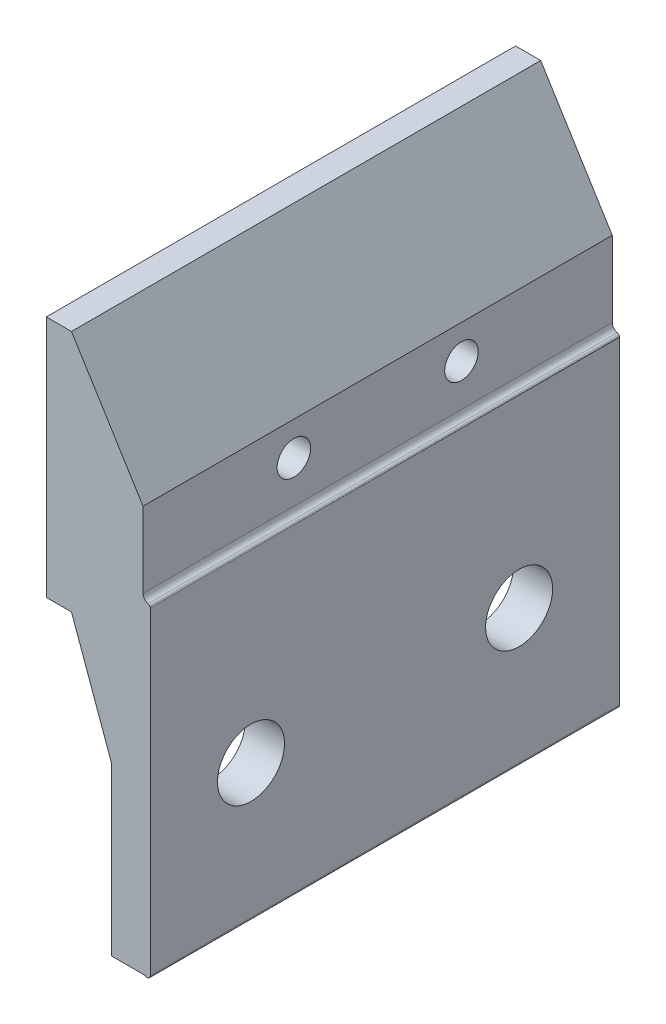
ISO-10303-21;
HEADER;
FILE_DESCRIPTION(('STEP AP214'),'2;1');
FILE_NAME('part.step','',(''),(''),'','','');
FILE_SCHEMA(('AUTOMOTIVE_DESIGN { 1 0 10303 214 1 1 1 1 }'));
ENDSEC;
DATA;
#1=APPLICATION_CONTEXT('core data for automotive mechanical design processes');
#2=APPLICATION_PROTOCOL_DEFINITION('international standard','automotive_design',2000,#1);
#3=PRODUCT_CONTEXT('',#1,'mechanical');
#4=PRODUCT('Part','Part','',(#3));
#5=PRODUCT_RELATED_PRODUCT_CATEGORY('part','',(#4));
#6=PRODUCT_DEFINITION_FORMATION('','',#4);
#7=PRODUCT_DEFINITION_CONTEXT('part definition',#1,'design');
#8=PRODUCT_DEFINITION('design','',#6,#7);
#9=PRODUCT_DEFINITION_SHAPE('','',#8);
#10=(LENGTH_UNIT() NAMED_UNIT(*) SI_UNIT(.MILLI.,.METRE.));
#11=(NAMED_UNIT(*) PLANE_ANGLE_UNIT() SI_UNIT($,.RADIAN.));
#12=(NAMED_UNIT(*) SI_UNIT($,.STERADIAN.) SOLID_ANGLE_UNIT());
#13=UNCERTAINTY_MEASURE_WITH_UNIT(LENGTH_MEASURE(1.E-05),#10,'distance_accuracy_value','');
#14=(GEOMETRIC_REPRESENTATION_CONTEXT(3) GLOBAL_UNCERTAINTY_ASSIGNED_CONTEXT((#13)) GLOBAL_UNIT_ASSIGNED_CONTEXT((#10,
#11,#12)) REPRESENTATION_CONTEXT('',''));
#15=CARTESIAN_POINT('',(0.,0.,0.));
#16=DIRECTION('',(0.,0.,1.));
#17=DIRECTION('',(1.,0.,0.));
#18=AXIS2_PLACEMENT_3D('',#15,#16,#17);
#19=CARTESIAN_POINT('',(-15.8526395142513,-15.4933634784557,28.));
#20=DIRECTION('',(1.,0.,0.));
#21=DIRECTION('',(0.,1.,0.));
#22=AXIS2_PLACEMENT_3D('',#19,#20,#21);
#23=PLANE('',#22);
#24=CARTESIAN_POINT('',(-15.8526395142514,-24.3915109359898,19.));
#25=DIRECTION('',(1.,0.,0.));
#26=DIRECTION('',(0.,1.,0.));
#27=AXIS2_PLACEMENT_3D('',#24,#25,#26);
#28=CIRCLE('',#27,1.);
#29=CARTESIAN_POINT('',(-15.8526395142514,-23.3915109359898,19.));
#30=VERTEX_POINT('',#29);
#31=EDGE_CURVE('E177',#30,#30,#28,.T.);
#32=ORIENTED_EDGE('',*,*,#31,.T.);
#33=EDGE_LOOP('',(#32));
#34=FACE_BOUND('',#33,.T.);
#35=DIRECTION('',(0.,-1.,0.));
#36=VECTOR('',#35,1.);
#37=CARTESIAN_POINT('',(-15.8526395142513,-15.4933634784557,0.));
#38=LINE('',#37,#36);
#39=CARTESIAN_POINT('',(-15.8526395142513,-15.4933634784557,0.));
#40=VERTEX_POINT('',#39);
#41=CARTESIAN_POINT('',(-15.8526395142514,-29.9933634784557,0.));
#42=VERTEX_POINT('',#41);
#43=EDGE_CURVE('E198',#40,#42,#38,.T.);
#44=ORIENTED_EDGE('',*,*,#43,.T.);
#45=DIRECTION('',(0.,0.,-1.));
#46=VECTOR('',#45,1.);
#47=CARTESIAN_POINT('',(-15.8526395142514,-29.9933634784557,28.));
#48=LINE('',#47,#46);
#49=CARTESIAN_POINT('',(-15.8526395142514,-29.9933634784557,28.));
#50=VERTEX_POINT('',#49);
#51=EDGE_CURVE('E11',#50,#42,#48,.T.);
#52=ORIENTED_EDGE('',*,*,#51,.F.);
#53=DIRECTION('',(0.,-1.,0.));
#54=VECTOR('',#53,1.);
#55=CARTESIAN_POINT('',(-15.8526395142513,-15.4933634784557,28.));
#56=LINE('',#55,#54);
#57=CARTESIAN_POINT('',(-15.8526395142513,-15.4933634784557,28.));
#58=VERTEX_POINT('',#57);
#59=EDGE_CURVE('E199',#58,#50,#56,.T.);
#60=ORIENTED_EDGE('',*,*,#59,.F.);
#61=DIRECTION('',(0.,0.,-1.));
#62=VECTOR('',#61,1.);
#63=CARTESIAN_POINT('',(-15.8526395142513,-15.4933634784557,28.));
#64=LINE('',#63,#62);
#65=EDGE_CURVE('E237',#58,#40,#64,.T.);
#66=ORIENTED_EDGE('',*,*,#65,.T.);
#67=EDGE_LOOP('',(#44,#52,#60,#66));
#68=FACE_BOUND('',#67,.T.);
#69=CARTESIAN_POINT('',(-15.8526395142514,-24.3915109359898,8.99999999999999));
#70=DIRECTION('',(1.,0.,0.));
#71=DIRECTION('',(0.,1.,0.));
#72=AXIS2_PLACEMENT_3D('',#69,#70,#71);
#73=CIRCLE('',#72,1.);
#74=CARTESIAN_POINT('',(-15.8526395142514,-23.3915109359898,8.99999999999999));
#75=VERTEX_POINT('',#74);
#76=EDGE_CURVE('E184',#75,#75,#73,.F.);
#77=ORIENTED_EDGE('',*,*,#76,.F.);
#78=EDGE_LOOP('',(#77));
#79=FACE_BOUND('',#78,.T.);
#80=ADVANCED_FACE('F45',(#34,#68,#79),#23,.F.);
#81=CARTESIAN_POINT('',(-14.3526395142514,-29.9933634784557,28.));
#82=DIRECTION('',(0.940596179684519,0.339527357900491,0.));
#83=DIRECTION('',(-0.339527357900491,0.940596179684519,0.));
#84=AXIS2_PLACEMENT_3D('',#81,#82,#83);
#85=PLANE('',#84);
#86=DIRECTION('',(0.,0.,-1.));
#87=VECTOR('',#86,1.);
#88=CARTESIAN_POINT('',(-11.9759480089479,-36.5775367362473,28.));
#89=LINE('',#88,#87);
#90=CARTESIAN_POINT('',(-11.9759480089479,-36.5775367362473,21.2445979279549));
#91=VERTEX_POINT('',#90);
#92=CARTESIAN_POINT('',(-11.9759480089479,-36.5775367362473,6.75540207204496));
#93=VERTEX_POINT('',#92);
#94=EDGE_CURVE('E155',#91,#93,#89,.T.);
#95=ORIENTED_EDGE('',*,*,#94,.F.);
#96=CARTESIAN_POINT('',(-11.3074831359265,-38.4293919437487,22.));
#97=DIRECTION('',(0.940596179684519,0.339527357900491,0.));
#98=DIRECTION('',(0.339527357900491,-0.940596179684519,0.));
#99=AXIS2_PLACEMENT_3D('',#96,#97,#98);
#100=ELLIPSE('',#99,2.12631099636277,2.);
#101=CARTESIAN_POINT('',(-11.9759480089479,-36.5775367362473,22.7554020720451));
#102=VERTEX_POINT('',#101);
#103=EDGE_CURVE('E68',#91,#102,#100,.T.);
#104=ORIENTED_EDGE('',*,*,#103,.T.);
#105=CARTESIAN_POINT('',(-11.9759480089479,-36.5775367362473,28.));
#106=VERTEX_POINT('',#105);
#107=EDGE_CURVE('E164',#106,#102,#89,.T.);
#108=ORIENTED_EDGE('',*,*,#107,.F.);
#109=DIRECTION('',(0.339527357900491,-0.940596179684519,0.));
#110=VECTOR('',#109,1.);
#111=CARTESIAN_POINT('',(-14.3526395142514,-29.9933634784557,28.));
#112=LINE('',#111,#110);
#113=CARTESIAN_POINT('',(-14.3526395142514,-29.9933634784557,28.));
#114=VERTEX_POINT('',#113);
#115=EDGE_CURVE('E207',#114,#106,#112,.T.);
#116=ORIENTED_EDGE('',*,*,#115,.F.);
#117=DIRECTION('',(0.,0.,-1.));
#118=VECTOR('',#117,1.);
#119=CARTESIAN_POINT('',(-14.3526395142514,-29.9933634784557,28.));
#120=LINE('',#119,#118);
#121=CARTESIAN_POINT('',(-14.3526395142514,-29.9933634784557,0.));
#122=VERTEX_POINT('',#121);
#123=EDGE_CURVE('E54',#114,#122,#120,.T.);
#124=ORIENTED_EDGE('',*,*,#123,.T.);
#125=DIRECTION('',(0.339527357900491,-0.940596179684519,0.));
#126=VECTOR('',#125,1.);
#127=CARTESIAN_POINT('',(-14.3526395142514,-29.9933634784557,0.));
#128=LINE('',#127,#126);
#129=CARTESIAN_POINT('',(-11.9759480089479,-36.5775367362473,0.));
#130=VERTEX_POINT('',#129);
#131=EDGE_CURVE('E244',#122,#130,#128,.T.);
#132=ORIENTED_EDGE('',*,*,#131,.T.);
#133=CARTESIAN_POINT('',(-11.9759480089479,-36.5775367362473,5.24459792795483));
#134=VERTEX_POINT('',#133);
#135=EDGE_CURVE('E157',#134,#130,#89,.T.);
#136=ORIENTED_EDGE('',*,*,#135,.F.);
#137=CARTESIAN_POINT('',(-11.3074831359265,-38.4293919437487,5.99999999999989));
#138=DIRECTION('',(0.940596179684519,0.339527357900491,0.));
#139=DIRECTION('',(0.339527357900491,-0.940596179684519,0.));
#140=AXIS2_PLACEMENT_3D('',#137,#138,#139);
#141=ELLIPSE('',#140,2.12631099636277,2.00000000000001);
#142=EDGE_CURVE('E61',#93,#134,#141,.F.);
#143=ORIENTED_EDGE('',*,*,#142,.F.);
#144=EDGE_LOOP('',(#95,#104,#108,#116,#124,#132,#136,#143));
#145=FACE_BOUND('',#144,.T.);
#146=ADVANCED_FACE('F154',(#145),#85,.F.);
#147=CARTESIAN_POINT('',(-11.9759480089479,-36.5775367362473,28.));
#148=DIRECTION('',(1.,0.,0.));
#149=DIRECTION('',(0.,1.,0.));
#150=AXIS2_PLACEMENT_3D('',#147,#148,#149);
#151=PLANE('',#150);
#152=ORIENTED_EDGE('',*,*,#107,.T.);
#153=CARTESIAN_POINT('',(-11.9759480089479,-38.4293919437487,22.));
#154=DIRECTION('',(1.,0.,0.));
#155=DIRECTION('',(0.,1.,0.));
#156=AXIS2_PLACEMENT_3D('',#153,#154,#155);
#157=CIRCLE('',#156,2.);
#158=EDGE_CURVE('E159',#102,#91,#157,.T.);
#159=ORIENTED_EDGE('',*,*,#158,.T.);
#160=ORIENTED_EDGE('',*,*,#94,.T.);
#161=CARTESIAN_POINT('',(-11.9759480089479,-38.4293919437487,5.99999999999989));
#162=DIRECTION('',(1.,0.,0.));
#163=DIRECTION('',(0.,1.,0.));
#164=AXIS2_PLACEMENT_3D('',#161,#162,#163);
#165=CIRCLE('',#164,2.00000000000001);
#166=EDGE_CURVE('E145',#134,#93,#165,.F.);
#167=ORIENTED_EDGE('',*,*,#166,.F.);
#168=ORIENTED_EDGE('',*,*,#135,.T.);
#169=DIRECTION('',(0.,-1.,0.));
#170=VECTOR('',#169,1.);
#171=CARTESIAN_POINT('',(-11.9759480089479,-36.5775367362473,0.));
#172=LINE('',#171,#170);
#173=CARTESIAN_POINT('',(-11.9759480089479,-46.5775367362473,0.));
#174=VERTEX_POINT('',#173);
#175=EDGE_CURVE('E247',#130,#174,#172,.T.);
#176=ORIENTED_EDGE('',*,*,#175,.T.);
#177=DIRECTION('',(0.,0.,-1.));
#178=VECTOR('',#177,1.);
#179=CARTESIAN_POINT('',(-11.9759480089479,-46.5775367362473,28.));
#180=LINE('',#179,#178);
#181=CARTESIAN_POINT('',(-11.9759480089479,-46.5775367362473,28.));
#182=VERTEX_POINT('',#181);
#183=EDGE_CURVE('E168',#182,#174,#180,.T.);
#184=ORIENTED_EDGE('',*,*,#183,.F.);
#185=DIRECTION('',(0.,-1.,0.));
#186=VECTOR('',#185,1.);
#187=CARTESIAN_POINT('',(-11.9759480089479,-36.5775367362473,28.));
#188=LINE('',#187,#186);
#189=EDGE_CURVE('E210',#106,#182,#188,.T.);
#190=ORIENTED_EDGE('',*,*,#189,.F.);
#191=EDGE_LOOP('',(#152,#159,#160,#167,#168,#176,#184,#190));
#192=FACE_BOUND('',#191,.T.);
#193=ADVANCED_FACE('F162',(#192),#151,.F.);
#194=CARTESIAN_POINT('',(-9.6415861078913,-27.4293919437487,28.));
#195=DIRECTION('',(-1.,0.,0.));
#196=DIRECTION('',(0.,0.,1.));
#197=AXIS2_PLACEMENT_3D('',#194,#195,#196);
#198=PLANE('',#197);
#199=DIRECTION('',(0.,1.,0.));
#200=VECTOR('',#199,1.);
#201=CARTESIAN_POINT('',(-9.6415861078913,-27.4293919437487,0.));
#202=LINE('',#201,#200);
#203=CARTESIAN_POINT('',(-9.6415861078913,-46.4293919437487,0.));
#204=VERTEX_POINT('',#203);
#205=CARTESIAN_POINT('',(-9.6415861078913,-27.4293919437487,0.));
#206=VERTEX_POINT('',#205);
#207=EDGE_CURVE('E257',#204,#206,#202,.T.);
#208=ORIENTED_EDGE('',*,*,#207,.T.);
#209=DIRECTION('',(0.,0.,-1.));
#210=VECTOR('',#209,1.);
#211=CARTESIAN_POINT('',(-9.6415861078913,-27.4293919437487,28.));
#212=LINE('',#211,#210);
#213=CARTESIAN_POINT('',(-9.6415861078913,-27.4293919437487,28.));
#214=VERTEX_POINT('',#213);
#215=EDGE_CURVE('E293',#214,#206,#212,.T.);
#216=ORIENTED_EDGE('',*,*,#215,.F.);
#217=DIRECTION('',(0.,1.,0.));
#218=VECTOR('',#217,1.);
#219=CARTESIAN_POINT('',(-9.6415861078913,-27.4293919437487,28.));
#220=LINE('',#219,#218);
#221=CARTESIAN_POINT('',(-9.6415861078913,-46.4293919437487,28.));
#222=VERTEX_POINT('',#221);
#223=EDGE_CURVE('E219',#222,#214,#220,.T.);
#224=ORIENTED_EDGE('',*,*,#223,.F.);
#225=DIRECTION('',(0.,0.,-1.));
#226=VECTOR('',#225,1.);
#227=CARTESIAN_POINT('',(-9.6415861078913,-46.4293919437487,28.));
#228=LINE('',#227,#226);
#229=EDGE_CURVE('E297',#222,#204,#228,.T.);
#230=ORIENTED_EDGE('',*,*,#229,.T.);
#231=EDGE_LOOP('',(#208,#216,#224,#230));
#232=FACE_BOUND('',#231,.T.);
#233=CARTESIAN_POINT('',(-9.64158610789127,-38.4293919437487,5.99999999999989));
#234=DIRECTION('',(1.,0.,0.));
#235=DIRECTION('',(0.,1.,0.));
#236=AXIS2_PLACEMENT_3D('',#233,#234,#235);
#237=CIRCLE('',#236,2.00000000000001);
#238=CARTESIAN_POINT('',(-9.64158610789127,-36.4293919437487,5.99999999999989));
#239=VERTEX_POINT('',#238);
#240=EDGE_CURVE('E419',#239,#239,#237,.F.);
#241=ORIENTED_EDGE('',*,*,#240,.T.);
#242=EDGE_LOOP('',(#241));
#243=FACE_BOUND('',#242,.T.);
#244=CARTESIAN_POINT('',(-9.64158610789127,-38.4293919437487,22.));
#245=DIRECTION('',(1.,0.,0.));
#246=DIRECTION('',(0.,1.,0.));
#247=AXIS2_PLACEMENT_3D('',#244,#245,#246);
#248=CIRCLE('',#247,2.);
#249=CARTESIAN_POINT('',(-9.64158610789127,-36.4293919437487,22.));
#250=VERTEX_POINT('',#249);
#251=EDGE_CURVE('E190',#250,#250,#248,.T.);
#252=ORIENTED_EDGE('',*,*,#251,.F.);
#253=EDGE_LOOP('',(#252));
#254=FACE_BOUND('',#253,.T.);
#255=ADVANCED_FACE('F325',(#232,#243,#254),#198,.F.);
#256=CARTESIAN_POINT('',(-10.0826416863058,-22.3915109359899,28.));
#257=DIRECTION('',(-1.,0.,0.));
#258=DIRECTION('',(0.,-1.,0.));
#259=AXIS2_PLACEMENT_3D('',#256,#257,#258);
#260=PLANE('',#259);
#261=CARTESIAN_POINT('',(-10.0826416863058,-24.3915109359899,19.));
#262=DIRECTION('',(-1.,0.,0.));
#263=DIRECTION('',(0.,-1.,0.));
#264=AXIS2_PLACEMENT_3D('',#261,#262,#263);
#265=CIRCLE('',#264,1.);
#266=CARTESIAN_POINT('',(-10.0826416863058,-25.3915109359899,19.));
#267=VERTEX_POINT('',#266);
#268=EDGE_CURVE('E174',#267,#267,#265,.T.);
#269=ORIENTED_EDGE('',*,*,#268,.T.);
#270=EDGE_LOOP('',(#269));
#271=FACE_BOUND('',#270,.T.);
#272=DIRECTION('',(0.,1.,0.));
#273=VECTOR('',#272,1.);
#274=CARTESIAN_POINT('',(-10.0826416863058,-22.3915109359899,0.));
#275=LINE('',#274,#273);
#276=CARTESIAN_POINT('',(-10.0826416863058,-26.8915109359899,0.));
#277=VERTEX_POINT('',#276);
#278=CARTESIAN_POINT('',(-10.0826416863058,-22.3915109359899,0.));
#279=VERTEX_POINT('',#278);
#280=EDGE_CURVE('E266',#277,#279,#275,.T.);
#281=ORIENTED_EDGE('',*,*,#280,.T.);
#282=DIRECTION('',(0.,0.,-1.));
#283=VECTOR('',#282,1.);
#284=CARTESIAN_POINT('',(-10.0826416863058,-22.3915109359899,28.));
#285=LINE('',#284,#283);
#286=CARTESIAN_POINT('',(-10.0826416863058,-22.3915109359899,28.));
#287=VERTEX_POINT('',#286);
#288=EDGE_CURVE('E281',#287,#279,#285,.T.);
#289=ORIENTED_EDGE('',*,*,#288,.F.);
#290=DIRECTION('',(0.,1.,0.));
#291=VECTOR('',#290,1.);
#292=CARTESIAN_POINT('',(-10.0826416863058,-22.3915109359899,28.));
#293=LINE('',#292,#291);
#294=CARTESIAN_POINT('',(-10.0826416863058,-26.8915109359899,28.));
#295=VERTEX_POINT('',#294);
#296=EDGE_CURVE('E228',#295,#287,#293,.T.);
#297=ORIENTED_EDGE('',*,*,#296,.F.);
#298=DIRECTION('',(0.,0.,-1.));
#299=VECTOR('',#298,1.);
#300=CARTESIAN_POINT('',(-10.0826416863058,-26.8915109359899,28.));
#301=LINE('',#300,#299);
#302=EDGE_CURVE('E285',#295,#277,#301,.T.);
#303=ORIENTED_EDGE('',*,*,#302,.T.);
#304=EDGE_LOOP('',(#281,#289,#297,#303));
#305=FACE_BOUND('',#304,.T.);
#306=CARTESIAN_POINT('',(-10.0826416863058,-24.3915109359899,8.99999999999999));
#307=DIRECTION('',(-1.,0.,0.));
#308=DIRECTION('',(0.,-1.,0.));
#309=AXIS2_PLACEMENT_3D('',#306,#307,#308);
#310=CIRCLE('',#309,1.);
#311=CARTESIAN_POINT('',(-10.0826416863058,-25.3915109359899,8.99999999999999));
#312=VERTEX_POINT('',#311);
#313=EDGE_CURVE('E48',#312,#312,#310,.F.);
#314=ORIENTED_EDGE('',*,*,#313,.F.);
#315=EDGE_LOOP('',(#314));
#316=FACE_BOUND('',#315,.T.);
#317=ADVANCED_FACE('F355',(#271,#305,#316),#260,.F.);
#318=CARTESIAN_POINT('',(-15.8526395142514,-29.9933634784557,28.));
#319=DIRECTION('',(0.,1.,0.));
#320=DIRECTION('',(0.,0.,1.));
#321=AXIS2_PLACEMENT_3D('',#318,#319,#320);
#322=PLANE('',#321);
#323=DIRECTION('',(1.,0.,0.));
#324=VECTOR('',#323,1.);
#325=CARTESIAN_POINT('',(-15.8526395142514,-29.9933634784557,0.));
#326=LINE('',#325,#324);
#327=EDGE_CURVE('E241',#42,#122,#326,.T.);
#328=ORIENTED_EDGE('',*,*,#327,.T.);
#329=ORIENTED_EDGE('',*,*,#123,.F.);
#330=DIRECTION('',(1.,0.,0.));
#331=VECTOR('',#330,1.);
#332=CARTESIAN_POINT('',(-15.8526395142514,-29.9933634784557,28.));
#333=LINE('',#332,#331);
#334=EDGE_CURVE('E203',#50,#114,#333,.T.);
#335=ORIENTED_EDGE('',*,*,#334,.F.);
#336=ORIENTED_EDGE('',*,*,#51,.T.);
#337=EDGE_LOOP('',(#328,#329,#335,#336));
#338=FACE_BOUND('',#337,.T.);
#339=ADVANCED_FACE('F336',(#338),#322,.F.);
#340=CARTESIAN_POINT('',(-9.97594800894791,-46.5775367362473,28.));
#341=DIRECTION('',(0.,1.,0.));
#342=DIRECTION('',(0.,0.,1.));
#343=AXIS2_PLACEMENT_3D('',#340,#341,#342);
#344=PLANE('',#343);
#345=DIRECTION('',(1.,0.,0.));
#346=VECTOR('',#345,1.);
#347=CARTESIAN_POINT('',(-9.97594800894791,-46.5775367362473,0.));
#348=LINE('',#347,#346);
#349=CARTESIAN_POINT('',(-9.97594800894791,-46.5775367362473,0.));
#350=VERTEX_POINT('',#349);
#351=EDGE_CURVE('E251',#174,#350,#348,.T.);
#352=ORIENTED_EDGE('',*,*,#351,.T.);
#353=DIRECTION('',(0.,0.,-1.));
#354=VECTOR('',#353,1.);
#355=CARTESIAN_POINT('',(-9.97594800894791,-46.5775367362473,28.));
#356=LINE('',#355,#354);
#357=CARTESIAN_POINT('',(-9.97594800894791,-46.5775367362473,28.));
#358=VERTEX_POINT('',#357);
#359=EDGE_CURVE('E300',#358,#350,#356,.T.);
#360=ORIENTED_EDGE('',*,*,#359,.F.);
#361=DIRECTION('',(1.,0.,0.));
#362=VECTOR('',#361,1.);
#363=CARTESIAN_POINT('',(-11.9759480089479,-46.5775367362473,28.));
#364=LINE('',#363,#362);
#365=EDGE_CURVE('E213',#182,#358,#364,.T.);
#366=ORIENTED_EDGE('',*,*,#365,.F.);
#367=ORIENTED_EDGE('',*,*,#183,.T.);
#368=EDGE_LOOP('',(#352,#360,#366,#367));
#369=FACE_BOUND('',#368,.T.);
#370=ADVANCED_FACE('F312',(#369),#344,.F.);
#371=CARTESIAN_POINT('',(-9.84158610789129,-46.4293919437487,28.));
#372=DIRECTION('',(0.,0.,-1.));
#373=DIRECTION('',(-1.,0.,0.));
#374=AXIS2_PLACEMENT_3D('',#371,#372,#373);
#375=CYLINDRICAL_SURFACE('',#374,0.2);
#376=CARTESIAN_POINT('',(-9.84158610789129,-46.4293919437487,0.));
#377=DIRECTION('',(0.,0.,1.));
#378=DIRECTION('',(-1.,0.,0.));
#379=AXIS2_PLACEMENT_3D('',#376,#377,#378);
#380=CIRCLE('',#379,0.2);
#381=EDGE_CURVE('E254',#350,#204,#380,.T.);
#382=ORIENTED_EDGE('',*,*,#381,.T.);
#383=ORIENTED_EDGE('',*,*,#229,.F.);
#384=CARTESIAN_POINT('',(-9.84158610789129,-46.4293919437487,28.));
#385=DIRECTION('',(0.,0.,1.));
#386=DIRECTION('',(-1.,0.,0.));
#387=AXIS2_PLACEMENT_3D('',#384,#385,#386);
#388=CIRCLE('',#387,0.2);
#389=EDGE_CURVE('E216',#358,#222,#388,.T.);
#390=ORIENTED_EDGE('',*,*,#389,.F.);
#391=ORIENTED_EDGE('',*,*,#359,.T.);
#392=EDGE_LOOP('',(#382,#383,#390,#391));
#393=FACE_BOUND('',#392,.T.);
#394=ADVANCED_FACE('F322',(#393),#375,.T.);
#395=CARTESIAN_POINT('',(-9.83715139669503,-27.4712753272692,28.));
#396=DIRECTION('',(0.,0.,-1.));
#397=DIRECTION('',(-1.,0.,0.));
#398=AXIS2_PLACEMENT_3D('',#395,#396,#397);
#399=CYLINDRICAL_SURFACE('',#398,0.200000000000007);
#400=CARTESIAN_POINT('',(-9.83715139669503,-27.4712753272692,0.));
#401=DIRECTION('',(0.,0.,1.));
#402=DIRECTION('',(-1.,0.,0.));
#403=AXIS2_PLACEMENT_3D('',#400,#401,#402);
#404=CIRCLE('',#403,0.200000000000007);
#405=CARTESIAN_POINT('',(-9.78564815989861,-27.2780205301761,0.));
#406=VERTEX_POINT('',#405);
#407=EDGE_CURVE('E260',#206,#406,#404,.T.);
#408=ORIENTED_EDGE('',*,*,#407,.T.);
#409=DIRECTION('',(0.,0.,-1.));
#410=VECTOR('',#409,1.);
#411=CARTESIAN_POINT('',(-9.78564815989861,-27.2780205301761,28.));
#412=LINE('',#411,#410);
#413=CARTESIAN_POINT('',(-9.78564815989861,-27.2780205301761,28.));
#414=VERTEX_POINT('',#413);
#415=EDGE_CURVE('E289',#414,#406,#412,.T.);
#416=ORIENTED_EDGE('',*,*,#415,.F.);
#417=CARTESIAN_POINT('',(-9.83715139669503,-27.4712753272692,28.));
#418=DIRECTION('',(0.,0.,1.));
#419=DIRECTION('',(-1.,0.,0.));
#420=AXIS2_PLACEMENT_3D('',#417,#418,#419);
#421=CIRCLE('',#420,0.200000000000007);
#422=EDGE_CURVE('E222',#214,#414,#421,.T.);
#423=ORIENTED_EDGE('',*,*,#422,.F.);
#424=ORIENTED_EDGE('',*,*,#215,.T.);
#425=EDGE_LOOP('',(#408,#416,#423,#424));
#426=FACE_BOUND('',#425,.T.);
#427=ADVANCED_FACE('F363',(#426),#399,.T.);
#428=CARTESIAN_POINT('',(-9.6826416863058,-26.8915109359899,28.));
#429=DIRECTION('',(0.,0.,-1.));
#430=DIRECTION('',(-1.,0.,0.));
#431=AXIS2_PLACEMENT_3D('',#428,#429,#430);
#432=CYLINDRICAL_SURFACE('',#431,0.4);
#433=CARTESIAN_POINT('',(-9.6826416863058,-26.8915109359899,0.));
#434=DIRECTION('',(0.,0.,-1.));
#435=DIRECTION('',(1.,0.,0.));
#436=AXIS2_PLACEMENT_3D('',#433,#434,#435);
#437=CIRCLE('',#436,0.4);
#438=EDGE_CURVE('E263',#406,#277,#437,.T.);
#439=ORIENTED_EDGE('',*,*,#438,.T.);
#440=ORIENTED_EDGE('',*,*,#302,.F.);
#441=CARTESIAN_POINT('',(-9.6826416863058,-26.8915109359899,28.));
#442=DIRECTION('',(0.,0.,-1.));
#443=DIRECTION('',(1.,0.,0.));
#444=AXIS2_PLACEMENT_3D('',#441,#442,#443);
#445=CIRCLE('',#444,0.4);
#446=EDGE_CURVE('E225',#414,#295,#445,.T.);
#447=ORIENTED_EDGE('',*,*,#446,.F.);
#448=ORIENTED_EDGE('',*,*,#415,.T.);
#449=EDGE_LOOP('',(#439,#440,#447,#448));
#450=FACE_BOUND('',#449,.T.);
#451=ADVANCED_FACE('F361',(#450),#432,.F.);
#452=CARTESIAN_POINT('',(-14.3526395142513,-15.4933634784557,28.));
#453=DIRECTION('',(-0.850280809358802,-0.526329312537446,0.));
#454=DIRECTION('',(0.526329312537446,-0.850280809358802,0.));
#455=AXIS2_PLACEMENT_3D('',#452,#453,#454);
#456=PLANE('',#455);
#457=DIRECTION('',(-0.526329312537446,0.850280809358802,0.));
#458=VECTOR('',#457,1.);
#459=CARTESIAN_POINT('',(-14.3526395142513,-15.4933634784557,0.));
#460=LINE('',#459,#458);
#461=CARTESIAN_POINT('',(-14.3526395142513,-15.4933634784557,0.));
#462=VERTEX_POINT('',#461);
#463=EDGE_CURVE('E269',#279,#462,#460,.T.);
#464=ORIENTED_EDGE('',*,*,#463,.T.);
#465=DIRECTION('',(0.,0.,-1.));
#466=VECTOR('',#465,1.);
#467=CARTESIAN_POINT('',(-14.3526395142513,-15.4933634784557,28.));
#468=LINE('',#467,#466);
#469=CARTESIAN_POINT('',(-14.3526395142513,-15.4933634784557,28.));
#470=VERTEX_POINT('',#469);
#471=EDGE_CURVE('E277',#470,#462,#468,.T.);
#472=ORIENTED_EDGE('',*,*,#471,.F.);
#473=DIRECTION('',(-0.526329312537446,0.850280809358802,0.));
#474=VECTOR('',#473,1.);
#475=CARTESIAN_POINT('',(-14.3526395142513,-15.4933634784557,28.));
#476=LINE('',#475,#474);
#477=EDGE_CURVE('E231',#287,#470,#476,.T.);
#478=ORIENTED_EDGE('',*,*,#477,.F.);
#479=ORIENTED_EDGE('',*,*,#288,.T.);
#480=EDGE_LOOP('',(#464,#472,#478,#479));
#481=FACE_BOUND('',#480,.T.);
#482=ADVANCED_FACE('F350',(#481),#456,.F.);
#483=CARTESIAN_POINT('',(-15.8526395142513,-15.4933634784557,28.));
#484=DIRECTION('',(0.,-1.,0.));
#485=DIRECTION('',(0.,0.,-1.));
#486=AXIS2_PLACEMENT_3D('',#483,#484,#485);
#487=PLANE('',#486);
#488=DIRECTION('',(-1.,0.,0.));
#489=VECTOR('',#488,1.);
#490=CARTESIAN_POINT('',(-15.8526395142513,-15.4933634784557,0.));
#491=LINE('',#490,#489);
#492=EDGE_CURVE('E204',#462,#40,#491,.T.);
#493=ORIENTED_EDGE('',*,*,#492,.T.);
#494=ORIENTED_EDGE('',*,*,#65,.F.);
#495=DIRECTION('',(-1.,0.,0.));
#496=VECTOR('',#495,1.);
#497=CARTESIAN_POINT('',(-15.8526395142513,-15.4933634784557,28.));
#498=LINE('',#497,#496);
#499=EDGE_CURVE('E234',#470,#58,#498,.T.);
#500=ORIENTED_EDGE('',*,*,#499,.F.);
#501=ORIENTED_EDGE('',*,*,#471,.T.);
#502=EDGE_LOOP('',(#493,#494,#500,#501));
#503=FACE_BOUND('',#502,.T.);
#504=ADVANCED_FACE('F346',(#503),#487,.F.);
#505=CARTESIAN_POINT('',(-9.84158610789129,-46.4293919437487,28.));
#506=DIRECTION('',(0.,0.,-1.));
#507=DIRECTION('',(-1.,0.,0.));
#508=AXIS2_PLACEMENT_3D('',#505,#506,#507);
#509=PLANE('',#508);
#510=ORIENTED_EDGE('',*,*,#59,.T.);
#511=ORIENTED_EDGE('',*,*,#334,.T.);
#512=ORIENTED_EDGE('',*,*,#115,.T.);
#513=ORIENTED_EDGE('',*,*,#189,.T.);
#514=ORIENTED_EDGE('',*,*,#365,.T.);
#515=ORIENTED_EDGE('',*,*,#389,.T.);
#516=ORIENTED_EDGE('',*,*,#223,.T.);
#517=ORIENTED_EDGE('',*,*,#422,.T.);
#518=ORIENTED_EDGE('',*,*,#446,.T.);
#519=ORIENTED_EDGE('',*,*,#296,.T.);
#520=ORIENTED_EDGE('',*,*,#477,.T.);
#521=ORIENTED_EDGE('',*,*,#499,.T.);
#522=EDGE_LOOP('',(#510,#511,#512,#513,#514,#515,#516,#517,#518,#519,#520,#521));
#523=FACE_BOUND('',#522,.T.);
#524=ADVANCED_FACE('F330',(#523),#509,.F.);
#525=CARTESIAN_POINT('',(-9.84158610789129,-46.4293919437487,0.));
#526=DIRECTION('',(0.,0.,-1.));
#527=DIRECTION('',(-1.,0.,0.));
#528=AXIS2_PLACEMENT_3D('',#525,#526,#527);
#529=PLANE('',#528);
#530=ORIENTED_EDGE('',*,*,#43,.F.);
#531=ORIENTED_EDGE('',*,*,#492,.F.);
#532=ORIENTED_EDGE('',*,*,#463,.F.);
#533=ORIENTED_EDGE('',*,*,#280,.F.);
#534=ORIENTED_EDGE('',*,*,#438,.F.);
#535=ORIENTED_EDGE('',*,*,#407,.F.);
#536=ORIENTED_EDGE('',*,*,#207,.F.);
#537=ORIENTED_EDGE('',*,*,#381,.F.);
#538=ORIENTED_EDGE('',*,*,#351,.F.);
#539=ORIENTED_EDGE('',*,*,#175,.F.);
#540=ORIENTED_EDGE('',*,*,#131,.F.);
#541=ORIENTED_EDGE('',*,*,#327,.F.);
#542=EDGE_LOOP('',(#530,#531,#532,#533,#534,#535,#536,#537,#538,#539,#540,#541));
#543=FACE_BOUND('',#542,.T.);
#544=ADVANCED_FACE('F318',(#543),#529,.T.);
#545=CARTESIAN_POINT('',(-15.8526395142514,-24.3915109359898,19.));
#546=DIRECTION('',(1.,0.,0.));
#547=DIRECTION('',(0.,1.,0.));
#548=AXIS2_PLACEMENT_3D('',#545,#546,#547);
#549=CYLINDRICAL_SURFACE('',#548,1.);
#550=ORIENTED_EDGE('',*,*,#31,.F.);
#551=EDGE_LOOP('',(#550));
#552=FACE_BOUND('',#551,.T.);
#553=ORIENTED_EDGE('',*,*,#268,.F.);
#554=EDGE_LOOP('',(#553));
#555=FACE_BOUND('',#554,.T.);
#556=ADVANCED_FACE('F400',(#552,#555),#549,.F.);
#557=CARTESIAN_POINT('',(-15.8526395142514,-24.3915109359898,8.99999999999999));
#558=DIRECTION('',(1.,0.,0.));
#559=DIRECTION('',(0.,1.,0.));
#560=AXIS2_PLACEMENT_3D('',#557,#558,#559);
#561=CYLINDRICAL_SURFACE('',#560,1.);
#562=ORIENTED_EDGE('',*,*,#76,.T.);
#563=EDGE_LOOP('',(#562));
#564=FACE_BOUND('',#563,.T.);
#565=ORIENTED_EDGE('',*,*,#313,.T.);
#566=EDGE_LOOP('',(#565));
#567=FACE_BOUND('',#566,.T.);
#568=ADVANCED_FACE('F404',(#564,#567),#561,.F.);
#569=CARTESIAN_POINT('',(-15.8526395142514,-38.4293919437487,5.99999999999989));
#570=DIRECTION('',(1.,0.,0.));
#571=DIRECTION('',(0.,1.,0.));
#572=AXIS2_PLACEMENT_3D('',#569,#570,#571);
#573=CYLINDRICAL_SURFACE('',#572,2.00000000000001);
#574=ORIENTED_EDGE('',*,*,#240,.F.);
#575=EDGE_LOOP('',(#574));
#576=FACE_BOUND('',#575,.T.);
#577=ORIENTED_EDGE('',*,*,#142,.T.);
#578=ORIENTED_EDGE('',*,*,#166,.T.);
#579=EDGE_LOOP('',(#577,#578));
#580=FACE_BOUND('',#579,.T.);
#581=ADVANCED_FACE('F146',(#576,#580),#573,.F.);
#582=CARTESIAN_POINT('',(-15.8526395142514,-38.4293919437487,22.));
#583=DIRECTION('',(1.,0.,0.));
#584=DIRECTION('',(0.,1.,0.));
#585=AXIS2_PLACEMENT_3D('',#582,#583,#584);
#586=CYLINDRICAL_SURFACE('',#585,2.);
#587=ORIENTED_EDGE('',*,*,#251,.T.);
#588=EDGE_LOOP('',(#587));
#589=FACE_BOUND('',#588,.T.);
#590=ORIENTED_EDGE('',*,*,#158,.F.);
#591=ORIENTED_EDGE('',*,*,#103,.F.);
#592=EDGE_LOOP('',(#590,#591));
#593=FACE_BOUND('',#592,.T.);
#594=ADVANCED_FACE('F406',(#589,#593),#586,.F.);
#595=CLOSED_SHELL('',(#80,#146,#193,#255,#317,#339,#370,#394,#427,#451,#482,#504,#524,#544,#556,
#568,#581,#594));
#596=MANIFOLD_SOLID_BREP('B2',#595);
#597=ADVANCED_BREP_SHAPE_REPRESENTATION('',(#18,#596),#14);
#598=SHAPE_DEFINITION_REPRESENTATION(#9,#597);
ENDSEC;
END-ISO-10303-21;
